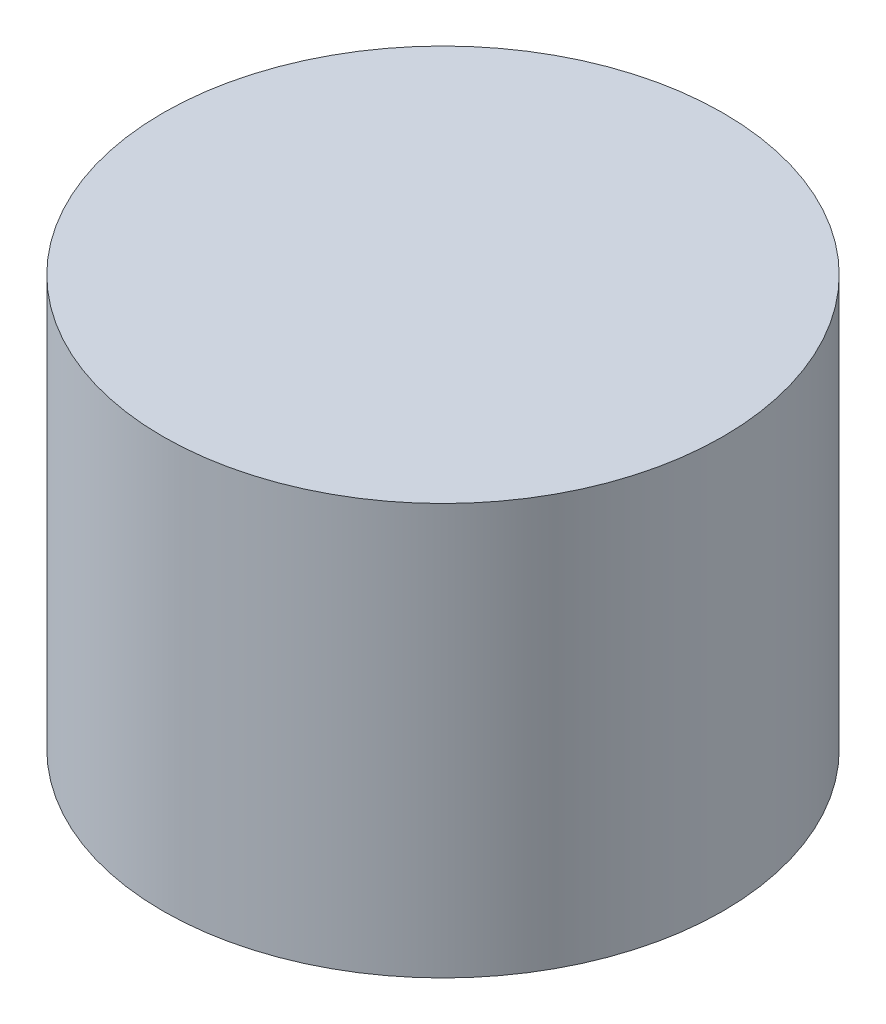
ISO-10303-21;
HEADER;
FILE_DESCRIPTION(('STEP AP214'),'2;1');
FILE_NAME('part.step','',(''),(''),'','','');
FILE_SCHEMA(('AUTOMOTIVE_DESIGN { 1 0 10303 214 1 1 1 1 }'));
ENDSEC;
DATA;
#1=APPLICATION_CONTEXT('core data for automotive mechanical design processes');
#2=APPLICATION_PROTOCOL_DEFINITION('international standard','automotive_design',2000,#1);
#3=PRODUCT_CONTEXT('',#1,'mechanical');
#4=PRODUCT('Part','Part','',(#3));
#5=PRODUCT_RELATED_PRODUCT_CATEGORY('part','',(#4));
#6=PRODUCT_DEFINITION_FORMATION('','',#4);
#7=PRODUCT_DEFINITION_CONTEXT('part definition',#1,'design');
#8=PRODUCT_DEFINITION('design','',#6,#7);
#9=PRODUCT_DEFINITION_SHAPE('','',#8);
#10=(LENGTH_UNIT() NAMED_UNIT(*) SI_UNIT(.MILLI.,.METRE.));
#11=(NAMED_UNIT(*) PLANE_ANGLE_UNIT() SI_UNIT($,.RADIAN.));
#12=(NAMED_UNIT(*) SI_UNIT($,.STERADIAN.) SOLID_ANGLE_UNIT());
#13=UNCERTAINTY_MEASURE_WITH_UNIT(LENGTH_MEASURE(1.E-05),#10,'distance_accuracy_value','');
#14=(GEOMETRIC_REPRESENTATION_CONTEXT(3) GLOBAL_UNCERTAINTY_ASSIGNED_CONTEXT((#13)) GLOBAL_UNIT_ASSIGNED_CONTEXT((#10,
#11,#12)) REPRESENTATION_CONTEXT('',''));
#15=CARTESIAN_POINT('',(0.,0.,0.));
#16=DIRECTION('',(0.,0.,1.));
#17=DIRECTION('',(1.,0.,0.));
#18=AXIS2_PLACEMENT_3D('',#15,#16,#17);
#19=CARTESIAN_POINT('',(0.,7.,0.));
#20=DIRECTION('',(0.,-1.,0.));
#21=DIRECTION('',(0.,0.,-1.));
#22=AXIS2_PLACEMENT_3D('',#19,#20,#21);
#23=CYLINDRICAL_SURFACE('',#22,6.5);
#24=CARTESIAN_POINT('',(0.,3.,0.));
#25=DIRECTION('',(0.,-1.,0.));
#26=DIRECTION('',(0.,0.,-1.));
#27=AXIS2_PLACEMENT_3D('',#24,#25,#26);
#28=CIRCLE('',#27,6.5);
#29=CARTESIAN_POINT('',(0.,3.,-6.5));
#30=VERTEX_POINT('',#29);
#31=EDGE_CURVE('E11',#30,#30,#28,.T.);
#32=ORIENTED_EDGE('',*,*,#31,.T.);
#33=EDGE_LOOP('',(#32));
#34=FACE_BOUND('',#33,.T.);
#35=CARTESIAN_POINT('',(0.,7.,0.));
#36=DIRECTION('',(0.,-1.,0.));
#37=DIRECTION('',(0.,0.,-1.));
#38=AXIS2_PLACEMENT_3D('',#35,#36,#37);
#39=CIRCLE('',#38,6.5);
#40=CARTESIAN_POINT('',(1.73205080756889,7.,-6.26498204307083));
#41=VERTEX_POINT('',#40);
#42=CARTESIAN_POINT('',(1.73205080756888,7.,6.26498204307083));
#43=VERTEX_POINT('',#42);
#44=EDGE_CURVE('E100',#41,#43,#39,.T.);
#45=ORIENTED_EDGE('',*,*,#44,.F.);
#46=CARTESIAN_POINT('',(0.,10.,-6.50000000000001));
#47=CARTESIAN_POINT('',(0.10958647155408,9.99999903907904,-6.49999929187437));
#48=CARTESIAN_POINT('',(0.219182761349475,9.99096335239673,-6.49720235792931));
#49=CARTESIAN_POINT('',(0.435175528984374,9.95515058806477,-6.48631855265072));
#50=CARTESIAN_POINT('',(0.541571186300283,9.92836900086749,-6.47823033671536));
#51=CARTESIAN_POINT('',(0.748016546984704,9.85804929310721,-6.45764858487677));
#52=CARTESIAN_POINT('',(0.848075627090346,9.81453663922322,-6.44516174661238));
#53=CARTESIAN_POINT('',(1.03947745536718,9.71209679263276,-6.4170753591794));
#54=CARTESIAN_POINT('',(1.13081890919356,9.65316731576617,-6.40147534884382));
#55=CARTESIAN_POINT('',(1.3049369924768,9.51970232456005,-6.36829752406617));
#56=CARTESIAN_POINT('',(1.38741488565838,9.44478758075688,-6.35067760587489));
#57=CARTESIAN_POINT('',(1.53885708269873,9.28228637649204,-6.31569252815343));
#58=CARTESIAN_POINT('',(1.60781896662595,9.19469765172806,-6.29832741475793));
#59=CARTESIAN_POINT('',(1.73187276184926,9.00677139557264,-6.2653687784566));
#60=CARTESIAN_POINT('',(1.78659481361997,8.90617971070223,-6.24982736044083));
#61=CARTESIAN_POINT('',(1.8782224418158,8.69666603626275,-6.22290748386974));
#62=CARTESIAN_POINT('',(1.91513254914664,8.58774617334561,-6.21152796681116));
#63=CARTESIAN_POINT('',(1.96900160513188,8.36803269394755,-6.19466009001292));
#64=CARTESIAN_POINT('',(1.98651339555991,8.25738746639271,-6.18900890037713));
#65=CARTESIAN_POINT('',(2.0028155589542,8.03459625942759,-6.1837537050085));
#66=CARTESIAN_POINT('',(2.00161073572821,7.9224506724825,-6.1841481476028));
#67=CARTESIAN_POINT('',(1.98094698228322,7.7043849294011,-6.19079569362892));
#68=CARTESIAN_POINT('',(1.96218684702854,7.59839057467777,-6.19682450731138));
#69=CARTESIAN_POINT('',(1.90807645250929,7.39113330340309,-6.2136977225505));
#70=CARTESIAN_POINT('',(1.87272447914839,7.28987087689416,-6.22454262164885));
#71=CARTESIAN_POINT('',(1.78593221700801,7.09326995215499,-6.25000070721951));
#72=CARTESIAN_POINT('',(1.73426970827152,6.99803651437155,-6.2646654217354));
#73=CARTESIAN_POINT('',(1.61647725848254,6.8173594556283,-6.29608673576222));
#74=CARTESIAN_POINT('',(1.55034365635742,6.73191832039407,-6.31284386417593));
#75=CARTESIAN_POINT('',(1.40204114131455,6.56929561166795,-6.34746551983527));
#76=CARTESIAN_POINT('',(1.31929416295853,6.49264371743337,-6.36534631113152));
#77=CARTESIAN_POINT('',(1.14189770882473,6.35417779565687,-6.39954830533242));
#78=CARTESIAN_POINT('',(1.04724740490766,6.2923648013595,-6.41586939958651));
#79=CARTESIAN_POINT('',(0.847732923697564,6.1849870228725,-6.44527556867775));
#80=CARTESIAN_POINT('',(0.742798718966915,6.13954513596117,-6.45833594999018));
#81=CARTESIAN_POINT('',(0.526280934909788,6.06711374604147,-6.47957102319473));
#82=CARTESIAN_POINT('',(0.414699321015772,6.04011881798934,-6.48774715140186));
#83=CARTESIAN_POINT('',(0.192552832432248,6.00624195342491,-6.49806290071845));
#84=CARTESIAN_POINT('',(0.0821071867281282,5.9986426474343,-6.50041772114305));
#85=CARTESIAN_POINT('',(-0.138491178007729,6.00175476648801,-6.49946000316609));
#86=CARTESIAN_POINT('',(-0.248643936188294,6.01246360693706,-6.49614826472318));
#87=CARTESIAN_POINT('',(-0.462785801451475,6.05131048211023,-6.48437074848216));
#88=CARTESIAN_POINT('',(-0.566859358780051,6.07902464716615,-6.47603039774079));
#89=CARTESIAN_POINT('',(-0.768852811369356,6.1505810764271,-6.45516726536364));
#90=CARTESIAN_POINT('',(-0.866771952253664,6.19442531327608,-6.44264397218779));
#91=CARTESIAN_POINT('',(-1.05627961444667,6.29817119480995,-6.41433382910965));
#92=CARTESIAN_POINT('',(-1.14766081519561,6.35843167676517,-6.39847611273321));
#93=CARTESIAN_POINT('',(-1.31925606832412,6.49286683008083,-6.36531333623026));
#94=CARTESIAN_POINT('',(-1.39946717074091,6.56704516497603,-6.34800789569185));
#95=CARTESIAN_POINT('',(-1.54963528009095,6.73058329944897,-6.31306645909659));
#96=CARTESIAN_POINT('',(-1.61908131008095,6.82041607594927,-6.29544322340724));
#97=CARTESIAN_POINT('',(-1.74195487773041,7.01084333460187,-6.26255963317191));
#98=CARTESIAN_POINT('',(-1.79538273895787,7.11143759931574,-6.24729923089955));
#99=CARTESIAN_POINT('',(-1.88435707765313,7.32027825692903,-6.22104126828922));
#100=CARTESIAN_POINT('',(-1.91997867102389,7.42849026977303,-6.21002584634022));
#101=CARTESIAN_POINT('',(-1.97237526121824,7.64978261572606,-6.19358575896333));
#102=CARTESIAN_POINT('',(-1.98915714872107,7.76286115316601,-6.18815904950703));
#103=CARTESIAN_POINT('',(-2.00291323790432,7.98534807210792,-6.18371932373485));
#104=CARTESIAN_POINT('',(-2.00072360720728,8.09470000455106,-6.18443554393434));
#105=CARTESIAN_POINT('',(-1.97860856561738,8.31139783884725,-6.19154584982148));
#106=CARTESIAN_POINT('',(-1.95868393542584,8.41874382879028,-6.19793968557835));
#107=CARTESIAN_POINT('',(-1.90221657867545,8.6269374285375,-6.21549850608436));
#108=CARTESIAN_POINT('',(-1.8659061649831,8.72785410568483,-6.22659666514378));
#109=CARTESIAN_POINT('',(-1.77788001247773,8.92224355662551,-6.25229841004041));
#110=CARTESIAN_POINT('',(-1.72616121006624,9.01571484538876,-6.26690269287626));
#111=CARTESIAN_POINT('',(-1.60648172875981,9.19641250748051,-6.29866516433668));
#112=CARTESIAN_POINT('',(-1.5379775201733,9.28326549413256,-6.31589943241282));
#113=CARTESIAN_POINT('',(-1.38763671757874,9.44451406697947,-6.35062263668655));
#114=CARTESIAN_POINT('',(-1.30579660000223,9.51890635028652,-6.36811163907407));
#115=CARTESIAN_POINT('',(-1.12802317077525,9.65544917959683,-6.40203042414332));
#116=CARTESIAN_POINT('',(-1.0317288656853,9.71714357533484,-6.41840990638034));
#117=CARTESIAN_POINT('',(-0.829631192009791,9.82338445665249,-6.44764383058531));
#118=CARTESIAN_POINT('',(-0.723831864032394,9.86793818662102,-6.46049976109691));
#119=CARTESIAN_POINT('',(-0.515929652571412,9.93510071206019,-6.48025348346413));
#120=CARTESIAN_POINT('',(-0.414403258515521,9.95936947108914,-6.48759534805451));
#121=CARTESIAN_POINT('',(-0.208587191828515,9.99181805932323,-6.4974684909107));
#122=CARTESIAN_POINT('',(-0.104298042658333,10.0000009145488,-6.50000067395289));
#123=CARTESIAN_POINT('',(0.,10.,-6.50000000000001));
#124=B_SPLINE_CURVE_WITH_KNOTS('',3,(#46,#47,#48,#49,#50,#51,#52,#53,#54,#55,#56,#57,#58,#59,
#60,#61,#62,#63,#64,#65,#66,#67,#68,#69,#70,#71,#72,#73,#74,#75,#76,#77,#78,#79,#80,#81,#82,#83,
#84,#85,#86,#87,#88,#89,#90,#91,#92,#93,#94,#95,#96,#97,#98,#99,#100,#101,#102,#103,#104,#105,
#106,#107,#108,#109,#110,#111,#112,#113,#114,#115,#116,#117,#118,#119,#120,#121,#122,#123),
.UNSPECIFIED.,.T.,.F.,(4,2,2,2,2,2,2,2,2,2,2,2,2,2,2,2,2,2,2,2,2,2,2,2,2,2,2,2,2,2,2,2,2,2,2,2,
2,2,4),(0.,0.328376148353205,0.656835774920465,0.984797413319646,1.31280767013795,
1.64969601962052,1.98664463123192,2.33162619975385,2.67651996741948,3.01130912746221,
3.34601236190893,3.66793485951994,3.98989062214147,4.31643724588171,4.64306657905953,
4.98408507994297,5.32512731933627,5.66867887562648,6.01212935372403,6.34267966649237,
6.67318331870837,6.99576592200042,7.31838798898983,7.64872325349811,7.97914559299322,
8.322234878021,8.66531723215741,9.00693981167225,9.34843740094787,9.67496275718919,
10.0014737403731,10.3234943027839,10.6455789342452,10.9799294848454,11.3143685200785,
11.6592775258489,12.0040405975475,12.3166287634493,12.6291581207982),.UNSPECIFIED.);
#125=CARTESIAN_POINT('',(-1.73205080756887,7.,-6.26498204307084));
#126=VERTEX_POINT('',#125);
#127=EDGE_CURVE('E149',#41,#126,#124,.T.);
#128=ORIENTED_EDGE('',*,*,#127,.T.);
#129=CARTESIAN_POINT('',(-1.73205080756888,7.,6.26498204307083));
#130=VERTEX_POINT('',#129);
#131=EDGE_CURVE('E90',#130,#126,#39,.T.);
#132=ORIENTED_EDGE('',*,*,#131,.F.);
#133=CARTESIAN_POINT('',(-2.,8.,6.18465843842648));
#134=CARTESIAN_POINT('',(-1.9999990095568,8.10944781666523,6.18465930196191));
#135=CARTESIAN_POINT('',(-1.99098535833565,8.21890548483824,6.18759551962699));
#136=CARTESIAN_POINT('',(-1.95526805100872,8.4346111816852,6.19897317486936));
#137=CARTESIAN_POINT('',(-1.92855917969018,8.54085825446286,6.2074162354361));
#138=CARTESIAN_POINT('',(-1.85845185053105,8.74698780797404,6.22876273970595));
#139=CARTESIAN_POINT('',(-1.8150822317129,8.84688094075819,6.24165847214778));
#140=CARTESIAN_POINT('',(-1.71298018316394,9.03799985089879,6.27044669026987));
#141=CARTESIAN_POINT('',(-1.65424519824939,9.12922418323406,6.28633967425532));
#142=CARTESIAN_POINT('',(-1.52098542811858,9.30345356947201,6.31992519486663));
#143=CARTESIAN_POINT('',(-1.44603755808562,9.38612742349218,6.33765756932835));
#144=CARTESIAN_POINT('',(-1.28338536224739,9.53795371808371,6.37258438430366));
#145=CARTESIAN_POINT('',(-1.19567931401686,9.607104329982,6.38977875180184));
#146=CARTESIAN_POINT('',(-1.00762969104172,9.73137363799946,6.4221466710909));
#147=CARTESIAN_POINT('',(-0.907051779246698,9.78615256785287,6.43726783390859));
#148=CARTESIAN_POINT('',(-0.697566498611637,9.87788894200935,6.46332130744831));
#149=CARTESIAN_POINT('',(-0.588661031083086,9.91485044031836,6.47425457092804));
#150=CARTESIAN_POINT('',(-0.369078789668962,9.96880071461249,6.49041842306583));
#151=CARTESIAN_POINT('',(-0.258553108996816,9.98635527672199,6.49581021502432));
#152=CARTESIAN_POINT('',(-0.0360024805210017,10.0027846064267,6.50085231846729));
#153=CARTESIAN_POINT('',(0.0760221311138315,10.0016634945557,6.50050389645218));
#154=CARTESIAN_POINT('',(0.29441356422115,9.98114844527175,6.4942177378733));
#155=CARTESIAN_POINT('',(0.400844233271026,9.96236759529849,6.48846753941673));
#156=CARTESIAN_POINT('',(0.608962506037097,9.90807040958312,6.47225351889556));
#157=CARTESIAN_POINT('',(0.71064980325399,9.8725529940272,6.46178939269854));
#158=CARTESIAN_POINT('',(0.90782598395705,9.78538875658138,6.43706860960457));
#159=CARTESIAN_POINT('',(1.00322571036048,9.73355326091787,6.42276789460409));
#160=CARTESIAN_POINT('',(1.18416561152014,9.61537480759448,6.39188462555487));
#161=CARTESIAN_POINT('',(1.26970334400256,9.54902826808111,6.37530150850161));
#162=CARTESIAN_POINT('',(1.43214818143839,9.40055088932973,6.34083036356049));
#163=CARTESIAN_POINT('',(1.50856604633594,9.31789001491942,6.32291668577951));
#164=CARTESIAN_POINT('',(1.64659789158783,9.14075606067757,6.28838540910676));
#165=CARTESIAN_POINT('',(1.70821023726841,9.04628167826866,6.27176795346722));
#166=CARTESIAN_POINT('',(1.81542815284785,8.84685693175613,6.24158384080898));
#167=CARTESIAN_POINT('',(1.86085804249382,8.74180658521936,6.22805120968131));
#168=CARTESIAN_POINT('',(1.93323233909799,8.52503128267039,6.20596978963966));
#169=CARTESIAN_POINT('',(1.96018314804153,8.41330865283467,6.19741927485068));
#170=CARTESIAN_POINT('',(1.99390183839658,8.19103547184524,6.1866516328359));
#171=CARTESIAN_POINT('',(2.00141677206859,8.0806095197673,6.18420022355391));
#172=CARTESIAN_POINT('',(1.99814331840788,7.86006861403926,6.18525890294931));
#173=CARTESIAN_POINT('',(1.98735765434067,7.74995361655912,6.18876810464339));
#174=CARTESIAN_POINT('',(1.94845591378718,7.53633739526088,6.20112183020872));
#175=CARTESIAN_POINT('',(1.92082922102701,7.43273743020314,6.20981554749739));
#176=CARTESIAN_POINT('',(1.84960144317458,7.23165311791168,6.23140033431748));
#177=CARTESIAN_POINT('',(1.80599780585853,7.13416975068448,6.24429207442193));
#178=CARTESIAN_POINT('',(1.70266083632211,6.94506908836894,6.27326823548526));
#179=CARTESIAN_POINT('',(1.642510447689,6.8536921478603,6.28943187401987));
#180=CARTESIAN_POINT('',(1.50827755720534,6.68205645444876,6.32296420859206));
#181=CARTESIAN_POINT('',(1.43419154645756,6.60180051059715,6.34033320743476));
#182=CARTESIAN_POINT('',(1.27066455897644,6.45137542136322,6.37515982745186));
#183=CARTESIAN_POINT('',(1.18072798127101,6.38173805229887,6.39259321140603));
#184=CARTESIAN_POINT('',(0.990026292988482,6.25852596385662,6.4248880498859));
#185=CARTESIAN_POINT('',(0.889261696820762,6.20495048188052,6.43974962650361));
#186=CARTESIAN_POINT('',(0.680404349890924,6.11589889700058,6.46513895511408));
#187=CARTESIAN_POINT('',(0.572372332564442,6.08028985839772,6.47569842330933));
#188=CARTESIAN_POINT('',(0.351472208803095,6.0278582342443,6.49143353701507));
#189=CARTESIAN_POINT('',(0.238605575732804,6.01102996689851,6.49661081078226));
#190=CARTESIAN_POINT('',(0.0161425784558991,5.99708774938302,6.5008937102874));
#191=CARTESIAN_POINT('',(-0.0934015930792339,5.99920450881627,6.50023627237803));
#192=CARTESIAN_POINT('',(-0.310503921550126,6.0212401975052,6.49348761016137));
#193=CARTESIAN_POINT('',(-0.418062200881387,6.04115802587313,6.48739672187997));
#194=CARTESIAN_POINT('',(-0.626896153328704,6.09774581224379,6.47053765408911));
#195=CARTESIAN_POINT('',(-0.72823100110444,6.13421524667687,6.45982553572913));
#196=CARTESIAN_POINT('',(-0.923394028801659,6.22269063398323,6.43482974334373));
#197=CARTESIAN_POINT('',(-1.01722093754076,6.27469921078922,6.4205454661916));
#198=CARTESIAN_POINT('',(-1.19809140790342,6.39477473631907,6.38931014060288));
#199=CARTESIAN_POINT('',(-1.28480651115009,6.463317333803,6.37228632231703));
#200=CARTESIAN_POINT('',(-1.44576009155786,6.61366948951744,6.33770998123227));
#201=CARTESIAN_POINT('',(-1.51999487724008,6.69548295904986,6.32015730380926));
#202=CARTESIAN_POINT('',(-1.65626040321865,6.87317697614795,6.28584951367574));
#203=CARTESIAN_POINT('',(-1.71782754366812,6.9694223551431,6.26913756348217));
#204=CARTESIAN_POINT('',(-1.82384213502379,7.17139075347286,6.23912274318891));
#205=CARTESIAN_POINT('',(-1.86829702453285,7.27710963003581,6.22581839266758));
#206=CARTESIAN_POINT('',(-1.93528263381638,7.48478819820058,6.2053035694979));
#207=CARTESIAN_POINT('',(-1.95948210366415,7.58616631120831,6.19763764909695));
#208=CARTESIAN_POINT('',(-1.99183943194677,7.79169373301637,6.18731524290854));
#209=CARTESIAN_POINT('',(-2.00000094256957,7.89584240542432,6.18465761663053));
#210=CARTESIAN_POINT('',(-2.,8.,6.18465843842648));
#211=B_SPLINE_CURVE_WITH_KNOTS('',3,(#133,#134,#135,#136,#137,#138,#139,#140,#141,#142,#143,
#144,#145,#146,#147,#148,#149,#150,#151,#152,#153,#154,#155,#156,#157,#158,#159,#160,#161,#162,
#163,#164,#165,#166,#167,#168,#169,#170,#171,#172,#173,#174,#175,#176,#177,#178,#179,#180,#181,
#182,#183,#184,#185,#186,#187,#188,#189,#190,#191,#192,#193,#194,#195,#196,#197,#198,#199,#200,
#201,#202,#203,#204,#205,#206,#207,#208,#209,#210),.UNSPECIFIED.,.T.,.F.,(4,2,2,2,2,2,2,2,2,2,2,
2,2,2,2,2,2,2,2,2,2,2,2,2,2,2,2,2,2,2,2,2,2,2,2,2,2,2,4),(0.,0.32795890482453,0.656014510157334,
0.983504805826268,1.31104959615494,1.64848092871026,1.9859578587312,2.33081172384084,
2.6755870871604,3.0100217177641,3.34438256088806,3.66754797200326,3.9907342360384,
4.31780371544651,4.64495401879589,4.98534121479608,5.32576597561374,5.66978125697087,
6.01367729564791,6.34414407424119,6.67456168122461,6.99580726669394,7.31710419166199,
7.64738828171959,7.97775564671482,8.32133560221229,8.66489924238099,9.00588210329357,
9.34676177779275,9.67386437135672,10.0009467370162,10.3241681048257,10.6474440825282,
10.9814486359996,11.3155518095369,11.6602881883484,12.0048745424384,12.3170524660658,
12.6291592918299),.UNSPECIFIED.);
#212=EDGE_CURVE('E102',#43,#130,#211,.T.);
#213=ORIENTED_EDGE('',*,*,#212,.F.);
#214=EDGE_LOOP('',(#45,#128,#132,#213));
#215=FACE_BOUND('',#214,.T.);
#216=ADVANCED_FACE('F40',(#34,#215),#23,.F.);
#217=CARTESIAN_POINT('',(0.,7.,0.));
#218=DIRECTION('',(0.,-1.,0.));
#219=DIRECTION('',(0.,0.,-1.));
#220=AXIS2_PLACEMENT_3D('',#217,#218,#219);
#221=PLANE('',#220);
#222=DIRECTION('',(0.,0.,1.));
#223=VECTOR('',#222,1.);
#224=CARTESIAN_POINT('',(1.73205080756889,7.,-7.));
#225=LINE('',#224,#223);
#226=CARTESIAN_POINT('',(1.73205080756888,7.,-4.69041575982343));
#227=VERTEX_POINT('',#226);
#228=EDGE_CURVE('E55',#41,#227,#225,.T.);
#229=ORIENTED_EDGE('',*,*,#228,.F.);
#230=ORIENTED_EDGE('',*,*,#44,.T.);
#231=DIRECTION('',(0.,0.,-1.));
#232=VECTOR('',#231,1.);
#233=CARTESIAN_POINT('',(1.73205080756888,7.,7.));
#234=LINE('',#233,#232);
#235=CARTESIAN_POINT('',(1.73205080756901,7.00000000000015,4.6904157598234));
#236=VERTEX_POINT('',#235);
#237=EDGE_CURVE('E112',#43,#236,#234,.T.);
#238=ORIENTED_EDGE('',*,*,#237,.T.);
#239=CARTESIAN_POINT('',(0.,7.,0.));
#240=DIRECTION('',(0.,-1.,0.));
#241=DIRECTION('',(0.,0.,-1.));
#242=AXIS2_PLACEMENT_3D('',#239,#240,#241);
#243=CIRCLE('',#242,5.);
#244=EDGE_CURVE('E97',#227,#236,#243,.T.);
#245=ORIENTED_EDGE('',*,*,#244,.F.);
#246=EDGE_LOOP('',(#229,#230,#238,#245));
#247=FACE_BOUND('',#246,.T.);
#248=ADVANCED_FACE('F144',(#247),#221,.T.);
#249=DIRECTION('',(0.,0.,1.));
#250=VECTOR('',#249,1.);
#251=CARTESIAN_POINT('',(-1.73205080756887,7.,-7.00000000000001));
#252=LINE('',#251,#250);
#253=CARTESIAN_POINT('',(-1.732050807569,7.00000000000014,-4.69041575982341));
#254=VERTEX_POINT('',#253);
#255=EDGE_CURVE('E82',#254,#126,#252,.F.);
#256=ORIENTED_EDGE('',*,*,#255,.F.);
#257=CARTESIAN_POINT('',(-1.73205080756888,7.,4.69041575982342));
#258=VERTEX_POINT('',#257);
#259=EDGE_CURVE('E89',#258,#254,#243,.T.);
#260=ORIENTED_EDGE('',*,*,#259,.F.);
#261=DIRECTION('',(0.,0.,-1.));
#262=VECTOR('',#261,1.);
#263=CARTESIAN_POINT('',(-1.73205080756888,7.,6.99999999999999));
#264=LINE('',#263,#262);
#265=EDGE_CURVE('E63',#258,#130,#264,.F.);
#266=ORIENTED_EDGE('',*,*,#265,.T.);
#267=ORIENTED_EDGE('',*,*,#131,.T.);
#268=EDGE_LOOP('',(#256,#260,#266,#267));
#269=FACE_BOUND('',#268,.T.);
#270=ADVANCED_FACE('F88',(#269),#221,.T.);
#271=CARTESIAN_POINT('',(0.,12.,0.));
#272=DIRECTION('',(0.,-1.,0.));
#273=DIRECTION('',(0.,0.,-1.));
#274=AXIS2_PLACEMENT_3D('',#271,#272,#273);
#275=CYLINDRICAL_SURFACE('',#274,5.);
#276=CARTESIAN_POINT('',(0.,12.,0.));
#277=DIRECTION('',(0.,-1.,0.));
#278=DIRECTION('',(0.,0.,-1.));
#279=AXIS2_PLACEMENT_3D('',#276,#277,#278);
#280=CIRCLE('',#279,5.);
#281=CARTESIAN_POINT('',(0.,12.,-5.));
#282=VERTEX_POINT('',#281);
#283=EDGE_CURVE('E96',#282,#282,#280,.T.);
#284=ORIENTED_EDGE('',*,*,#283,.F.);
#285=EDGE_LOOP('',(#284));
#286=FACE_BOUND('',#285,.T.);
#287=ORIENTED_EDGE('',*,*,#259,.T.);
#288=CARTESIAN_POINT('',(0.,10.,-5.00000000000001));
#289=CARTESIAN_POINT('',(0.107493005442892,9.99999014817627,-4.99999271227085));
#290=CARTESIAN_POINT('',(0.215172564090674,9.99128224791162,-4.99649294306933));
#291=CARTESIAN_POINT('',(0.427496480417898,9.95675229647876,-4.98283453100642));
#292=CARTESIAN_POINT('',(0.532131777561251,9.93088372091387,-4.97265778698878));
#293=CARTESIAN_POINT('',(0.734953922727406,9.86312392194117,-4.94674209213119));
#294=CARTESIAN_POINT('',(0.833160661616962,9.82128515378327,-4.93102136364072));
#295=CARTESIAN_POINT('',(1.02107197032837,9.72298082667345,-4.89556610796078));
#296=CARTESIAN_POINT('',(1.11077947675099,9.66652034508107,-4.87583297458057));
#297=CARTESIAN_POINT('',(1.2835010075704,9.53776450143906,-4.83330886170419));
#298=CARTESIAN_POINT('',(1.36606227255022,9.46489334375974,-4.8104229692919));
#299=CARTESIAN_POINT('',(1.51817500478473,9.30659999652322,-4.76460576906194));
#300=CARTESIAN_POINT('',(1.58772010713354,9.22117170278826,-4.74167444453792));
#301=CARTESIAN_POINT('',(1.71487456729288,9.03557192975773,-4.69722791797136));
#302=CARTESIAN_POINT('',(1.77181498119548,8.9349135139768,-4.67582115964951));
#303=CARTESIAN_POINT('',(1.86775471903715,8.72446360157996,-4.63833647186792));
#304=CARTESIAN_POINT('',(1.90676256428584,8.61467647215164,-4.62225601244176));
#305=CARTESIAN_POINT('',(1.96389882339587,8.3942876664079,-4.59826357660819));
#306=CARTESIAN_POINT('',(1.98289396580565,8.28394876442379,-4.59001420355605));
#307=CARTESIAN_POINT('',(2.00217296164003,8.06136500169273,-4.58164004049144));
#308=CARTESIAN_POINT('',(2.00246601631322,7.94912110537499,-4.58151125522769));
#309=CARTESIAN_POINT('',(1.98498936750455,7.73424332854196,-4.58910500279995));
#310=CARTESIAN_POINT('',(1.96847531430514,7.63148428559097,-4.5962817503845));
#311=CARTESIAN_POINT('',(1.91994688029783,7.43034044399328,-4.61676187607836));
#312=CARTESIAN_POINT('',(1.88792979480463,7.33195641188969,-4.63006632321673));
#313=CARTESIAN_POINT('',(1.80869473255107,7.13998216380396,-4.6615948508853));
#314=CARTESIAN_POINT('',(1.76117986231532,7.04653076094531,-4.67991379280788));
#315=CARTESIAN_POINT('',(1.65250646073222,6.86858418363843,-4.7193811638989));
#316=CARTESIAN_POINT('',(1.59134280510085,6.78409239059719,-4.74053065456848));
#317=CARTESIAN_POINT('',(1.45155059945444,6.619590271198,-4.78526736742271));
#318=CARTESIAN_POINT('',(1.37193746297064,6.54043127055398,-4.80891664976151));
#319=CARTESIAN_POINT('',(1.2003144274302,6.39631552199796,-4.85459824958282));
#320=CARTESIAN_POINT('',(1.10830206533444,6.33136160258971,-4.87663024445325));
#321=CARTESIAN_POINT('',(0.912077652605845,6.21638255258417,-4.91714681264549));
#322=CARTESIAN_POINT('',(0.80766049134648,6.16667771880294,-4.93555270095415));
#323=CARTESIAN_POINT('',(0.591023765482885,6.08583213892194,-4.96614828328759));
#324=CARTESIAN_POINT('',(0.478808196849678,6.05468196244259,-4.97834113462383));
#325=CARTESIAN_POINT('',(0.256895887607825,6.0135517045803,-4.99456139506911));
#326=CARTESIAN_POINT('',(0.14744329398554,6.00242754574644,-4.99902945833514));
#327=CARTESIAN_POINT('',(-0.0718453098078114,5.99828689947138,-5.00068478510631));
#328=CARTESIAN_POINT('',(-0.181681213223918,6.00526571845249,-4.99787393582292));
#329=CARTESIAN_POINT('',(-0.393432739121981,6.03629175255199,-4.98557567063754));
#330=CARTESIAN_POINT('',(-0.495482491775468,6.05955798035098,-4.97639391345524));
#331=CARTESIAN_POINT('',(-0.694135428060775,6.12143570830981,-4.952594414055));
#332=CARTESIAN_POINT('',(-0.790737910224841,6.16004917966868,-4.9379759735653));
#333=CARTESIAN_POINT('',(-0.979078785816698,6.25278493967995,-4.90416594770812));
#334=CARTESIAN_POINT('',(-1.0705780227554,6.30734547204315,-4.88484815979804));
#335=CARTESIAN_POINT('',(-1.24344359124655,6.42994032390564,-4.84373364745525));
#336=CARTESIAN_POINT('',(-1.32480584076112,6.49798004292261,-4.82193593110271));
#337=CARTESIAN_POINT('',(-1.48072304302882,6.65087001294962,-4.77645117638113));
#338=CARTESIAN_POINT('',(-1.55447393380606,6.73653354150621,-4.75273441425052));
#339=CARTESIAN_POINT('',(-1.68675119741371,6.91944008300937,-4.70741672917132));
#340=CARTESIAN_POINT('',(-1.74527506133751,7.01668500033995,-4.68581615526512));
#341=CARTESIAN_POINT('',(-1.84580750193163,7.2214616945941,-4.64714299907709));
#342=CARTESIAN_POINT('',(-1.88765059453445,7.32908399921231,-4.63011630884788));
#343=CARTESIAN_POINT('',(-1.9522962197053,7.55073365171515,-4.60323673477932));
#344=CARTESIAN_POINT('',(-1.97511280526931,7.66475620581242,-4.59337855695999));
#345=CARTESIAN_POINT('',(-1.9997156172784,7.88712790177454,-4.58271759299927));
#346=CARTESIAN_POINT('',(-2.00289708230286,7.99529483959335,-4.58131421008172));
#347=CARTESIAN_POINT('',(-1.99180315927752,8.21054485771329,-4.58614836033098));
#348=CARTESIAN_POINT('',(-1.97752998791378,8.31762807390258,-4.59238492324794));
#349=CARTESIAN_POINT('',(-1.93307136615365,8.52333218985504,-4.61126649079021));
#350=CARTESIAN_POINT('',(-1.90353749357097,8.622120274433,-4.6236483182745));
#351=CARTESIAN_POINT('',(-1.83000544849101,8.81337862961348,-4.65324001232697));
#352=CARTESIAN_POINT('',(-1.78600328139381,8.90584714689982,-4.67045121206008));
#353=CARTESIAN_POINT('',(-1.68187276275973,9.08760961927078,-4.70898609604492));
#354=CARTESIAN_POINT('',(-1.62096533515948,9.17641867013048,-4.73048882313242));
#355=CARTESIAN_POINT('',(-1.48589211927149,9.34299331720375,-4.77463804372237));
#356=CARTESIAN_POINT('',(-1.41172233481812,9.42075557212831,-4.79728488048407));
#357=CARTESIAN_POINT('',(-1.24650550627246,9.56820285326361,-4.84293567087395));
#358=CARTESIAN_POINT('',(-1.15467600114614,9.63703730689806,-4.86586757962186));
#359=CARTESIAN_POINT('',(-0.959900320285775,9.75833704262163,-4.90800406713717));
#360=CARTESIAN_POINT('',(-0.856949004547234,9.81079471215252,-4.92720691092906));
#361=CARTESIAN_POINT('',(-0.6447380624952,9.89662221519029,-4.95939714815861));
#362=CARTESIAN_POINT('',(-0.535631618219692,9.93032932356034,-4.97249363055028));
#363=CARTESIAN_POINT('',(-0.312876546281215,9.97863912095426,-4.99144306209366));
#364=CARTESIAN_POINT('',(-0.199243525858908,9.9933024367439,-4.99731899495638));
#365=CARTESIAN_POINT('',(-0.0569122978909262,9.99939538097827,-4.99975899504137));
#366=CARTESIAN_POINT('',(-0.0284626887407567,10.0000026086292,-5.00000192969176));
#367=CARTESIAN_POINT('',(0.,10.,-5.00000000000001));
#368=B_SPLINE_CURVE_WITH_KNOTS('',3,(#288,#289,#290,#291,#292,#293,#294,#295,#296,#297,#298,
#299,#300,#301,#302,#303,#304,#305,#306,#307,#308,#309,#310,#311,#312,#313,#314,#315,#316,#317,
#318,#319,#320,#321,#322,#323,#324,#325,#326,#327,#328,#329,#330,#331,#332,#333,#334,#335,#336,
#337,#338,#339,#340,#341,#342,#343,#344,#345,#346,#347,#348,#349,#350,#351,#352,#353,#354,#355,
#356,#357,#358,#359,#360,#361,#362,#363,#364,#365,#366,#367),.UNSPECIFIED.,.T.,.F.,(4,2,2,2,2,2,
2,2,2,2,2,2,2,2,2,2,2,2,2,2,2,2,2,2,2,2,2,2,2,2,2,2,2,2,2,2,2,2,2,4),(0.,0.322402987893073,
0.645683636007937,0.967911457471584,1.29002753567985,1.62597381700398,1.96208394934412,
2.31315258819217,2.66405423118268,2.99904105308829,3.33386306340488,3.64538328401373,
3.95695787256048,4.27489126298816,4.59294421938184,4.93558349186557,5.27829092839733,
5.62776913162807,5.97706956113791,6.30569184528008,6.63422893570082,6.94800455564366,
7.26182048993797,7.58523513398263,7.90877959498969,8.25368474624414,8.59864669043748,
8.94695045140828,9.29499672645934,9.61799673392748,9.94095572563046,10.2511431854877,
10.5614163580516,10.8894546805669,11.2175920134839,11.5670042353384,11.9165786364053,
12.2596430101332,12.6016125240434,12.686980458968),.UNSPECIFIED.);
#369=EDGE_CURVE('E48',#254,#227,#368,.T.);
#370=ORIENTED_EDGE('',*,*,#369,.T.);
#371=ORIENTED_EDGE('',*,*,#244,.T.);
#372=CARTESIAN_POINT('',(-2.,8.,4.58257569495583));
#373=CARTESIAN_POINT('',(-1.99999540068023,8.10712368971296,4.58258022779734));
#374=CARTESIAN_POINT('',(-1.99134173553407,8.21442629433184,4.58638433797122));
#375=CARTESIAN_POINT('',(-1.95706710874823,8.42593908409957,4.601110833066));
#376=CARTESIAN_POINT('',(-1.93140279032341,8.53014065433852,4.61205140628346));
#377=CARTESIAN_POINT('',(-1.86423554476216,8.73205180897082,4.63960410719221));
#378=CARTESIAN_POINT('',(-1.82279228998551,8.82978424329122,4.65619484260882));
#379=CARTESIAN_POINT('',(-1.72542013194152,9.0168853548623,4.69314677188873));
#380=CARTESIAN_POINT('',(-1.66949439157707,9.1062558525241,4.71350714220611));
#381=CARTESIAN_POINT('',(-1.54132201423254,9.27926031454433,4.75700861562335));
#382=CARTESIAN_POINT('',(-1.46837936836551,9.36235639939724,4.78023917022606));
#383=CARTESIAN_POINT('',(-1.30970909513216,9.5155290208558,4.82612457915278));
#384=CARTESIAN_POINT('',(-1.22397701877347,9.5856010077097,4.84877922991761));
#385=CARTESIAN_POINT('',(-1.03800631337303,9.71340639030971,4.89203407641395));
#386=CARTESIAN_POINT('',(-0.937328966419095,9.77054429968594,4.9125180361257));
#387=CARTESIAN_POINT('',(-0.726825322068637,9.86684357017379,4.94803927702516));
#388=CARTESIAN_POINT('',(-0.617002769076881,9.90601224624887,4.96307877403249));
#389=CARTESIAN_POINT('',(-0.396966427039752,9.96334148599309,4.98538324990609));
#390=CARTESIAN_POINT('',(-0.287028984858316,9.98242731397022,4.99298936770628));
#391=CARTESIAN_POINT('',(-0.0652663285839641,10.0020284857814,5.0008031068743));
#392=CARTESIAN_POINT('',(0.0465581658394078,10.0025507559658,5.00101348770555));
#393=CARTESIAN_POINT('',(0.262232494702086,9.9855172301958,4.99421962820612));
#394=CARTESIAN_POINT('',(0.366177452870455,9.96897522724528,4.98761996771485));
#395=CARTESIAN_POINT('',(0.569673109221913,9.92000712369703,4.96849291469141));
#396=CARTESIAN_POINT('',(0.669223484391238,9.88757985760154,4.95596508721341));
#397=CARTESIAN_POINT('',(0.862897938510558,9.80736351712174,4.92596824457466));
#398=CARTESIAN_POINT('',(0.956917623378896,9.75935028518462,4.90842760466223));
#399=CARTESIAN_POINT('',(1.13580815074131,9.64953499308084,4.87014585180275));
#400=CARTESIAN_POINT('',(1.22067584271796,9.58772820689983,4.84940364267149));
#401=CARTESIAN_POINT('',(1.38476882799017,9.44735086405612,4.80521637176122));
#402=CARTESIAN_POINT('',(1.46325784526632,9.3679461074272,4.78168326511759));
#403=CARTESIAN_POINT('',(1.60610741539265,9.197009428168,4.73561660973263));
#404=CARTESIAN_POINT('',(1.67046334378698,9.10547355180439,4.71308339008076));
#405=CARTESIAN_POINT('',(1.78490418871927,8.90958097762606,4.67096897409023));
#406=CARTESIAN_POINT('',(1.83453465163626,8.80493516966135,4.65148914057708));
#407=CARTESIAN_POINT('',(1.91517625986646,8.58778450968778,4.61887590344084));
#408=CARTESIAN_POINT('',(1.94619949837798,8.47528481527341,4.6057383789131));
#409=CARTESIAN_POINT('',(1.98695494885489,8.25296422253256,4.58829759702715));
#410=CARTESIAN_POINT('',(1.99787209681454,8.14339955287144,4.58350366456138));
#411=CARTESIAN_POINT('',(2.00156132644289,7.92392279224044,4.58189497869038));
#412=CARTESIAN_POINT('',(1.99433891059128,7.81401081672434,4.58507780560361));
#413=CARTESIAN_POINT('',(1.96303289479003,7.60354106504306,4.59856044359113));
#414=CARTESIAN_POINT('',(1.93993306202386,7.50280706259994,4.60844457798301));
#415=CARTESIAN_POINT('',(1.87880418691087,7.30671159521455,4.6337005102734));
#416=CARTESIAN_POINT('',(1.84077183430228,7.21135132689285,4.64907352488598));
#417=CARTESIAN_POINT('',(1.74913563948157,7.02439764220434,4.68433781860101));
#418=CARTESIAN_POINT('',(1.69496286826465,6.93311381130546,4.70438704639177));
#419=CARTESIAN_POINT('',(1.57316522444182,6.76051701255841,4.74650385157795));
#420=CARTESIAN_POINT('',(1.50553487348189,6.67920812720455,4.76857224896045));
#421=CARTESIAN_POINT('',(1.35284421168058,6.52262659140063,4.81420915971417));
#422=CARTESIAN_POINT('',(1.26686542944543,6.4482434347084,4.83776807285233));
#423=CARTESIAN_POINT('',(1.0830836333685,6.31482292339023,4.88219794567532));
#424=CARTESIAN_POINT('',(0.985280138466605,6.25578619340488,4.90306879593135));
#425=CARTESIAN_POINT('',(0.780279934003012,6.15495237353666,4.93983715900389));
#426=CARTESIAN_POINT('',(0.673085480998743,6.11315115582633,4.9557358624066));
#427=CARTESIAN_POINT('',(0.452393590914546,6.04845114760024,4.98072713468904));
#428=CARTESIAN_POINT('',(0.338899610276817,6.02554209858931,4.98982339706103));
#429=CARTESIAN_POINT('',(0.116816510362613,6.00049529834715,4.99979008211858));
#430=CARTESIAN_POINT('',(0.00839049265208421,5.99709987143797,5.00115846749745));
#431=CARTESIAN_POINT('',(-0.207433835792269,6.00785547938346,4.99686042373721));
#432=CARTESIAN_POINT('',(-0.31483229961439,6.02200385815558,4.99119505948774));
#433=CARTESIAN_POINT('',(-0.5221709017334,6.06654678799988,4.97371513381836));
#434=CARTESIAN_POINT('',(-0.622238803864871,6.09642894475655,4.96209480698998));
#435=CARTESIAN_POINT('',(-0.815922355542606,6.17105280588107,4.93394947767358));
#436=CARTESIAN_POINT('',(-0.909536811189125,6.21579725093909,4.91742357062859));
#437=CARTESIAN_POINT('',(-1.09220303880516,6.32110319335323,4.88018094611867));
#438=CARTESIAN_POINT('',(-1.18087037518738,6.38227627532513,4.859311306872));
#439=CARTESIAN_POINT('',(-1.34705404014793,6.51778853874699,4.8158940222708));
#440=CARTESIAN_POINT('',(-1.42456572919735,6.59213316960821,4.79334568464252));
#441=CARTESIAN_POINT('',(-1.57120121894449,6.75731514684866,4.74737767367679));
#442=CARTESIAN_POINT('',(-1.63950871002775,6.8488885751441,4.72399047228096));
#443=CARTESIAN_POINT('',(-1.7598476276315,7.04294243572083,4.68049656850749));
#444=CARTESIAN_POINT('',(-1.81187714055768,7.14542414845354,4.66039025195447));
#445=CARTESIAN_POINT('',(-1.89399048451634,7.3490361864702,4.62758914239063));
#446=CARTESIAN_POINT('',(-1.92562535665267,7.44946160271244,4.61439096680415));
#447=CARTESIAN_POINT('',(-1.97271990928489,7.65448904149264,4.59445826034119));
#448=CARTESIAN_POINT('',(-1.98822466191609,7.75907857342435,4.58770572290433));
#449=CARTESIAN_POINT('',(-1.99692202185513,7.88677823911152,4.5839176394209));
#450=CARTESIAN_POINT('',(-1.99807530751895,7.90940148035643,4.58341531117284));
#451=CARTESIAN_POINT('',(-1.9996148112425,7.95468047679722,4.58274384722723));
#452=CARTESIAN_POINT('',(-2.0000009730612,7.97733623425516,4.5825747359592));
#453=CARTESIAN_POINT('',(-2.,8.,4.58257569495583));
#454=B_SPLINE_CURVE_WITH_KNOTS('',3,(#372,#373,#374,#375,#376,#377,#378,#379,#380,#381,#382,
#383,#384,#385,#386,#387,#388,#389,#390,#391,#392,#393,#394,#395,#396,#397,#398,#399,#400,#401,
#402,#403,#404,#405,#406,#407,#408,#409,#410,#411,#412,#413,#414,#415,#416,#417,#418,#419,#420,
#421,#422,#423,#424,#425,#426,#427,#428,#429,#430,#431,#432,#433,#434,#435,#436,#437,#438,#439,
#440,#441,#442,#443,#444,#445,#446,#447,#448,#449,#450,#451,#452,#453),.UNSPECIFIED.,.T.,.F.,(4,
2,2,2,2,2,2,2,2,2,2,2,2,2,2,2,2,2,2,2,2,2,2,2,2,2,2,2,2,2,2,2,2,2,2,2,2,2,2,2,4),(0.,
0.321277648767655,0.643377335822244,0.964270823293389,1.28509428823861,1.62255618284425,
1.96013574348342,2.31102669091428,2.66177466969481,2.99554182887184,3.32918445305672,
3.64408644830302,3.9590115512906,4.27868300234898,4.59846414940031,4.93924044081356,
5.28012807127127,5.63064458717257,5.98093304800101,6.30982147524421,6.63861014907939,
6.94867248085145,7.25880358651638,7.58151154652701,7.9043511452585,8.2510373424698,
8.59773764852748,8.94435487312813,9.29078375954136,9.61461039755953,9.93838801512602,
10.2522199444335,10.5661097782859,10.8938705113993,11.2217671656421,11.5699625328561,
11.9181988175919,12.2351666081908,12.5512463021924,12.619212852096,12.6871843847256),.UNSPECIFIED.);
#455=EDGE_CURVE('E95',#258,#236,#454,.T.);
#456=ORIENTED_EDGE('',*,*,#455,.F.);
#457=EDGE_LOOP('',(#287,#370,#371,#456));
#458=FACE_BOUND('',#457,.T.);
#459=ADVANCED_FACE('F93',(#286,#458),#275,.F.);
#460=CARTESIAN_POINT('',(0.,8.,-7.00000000000001));
#461=DIRECTION('',(0.,0.,1.));
#462=DIRECTION('',(1.,0.,0.));
#463=AXIS2_PLACEMENT_3D('',#460,#461,#462);
#464=CYLINDRICAL_SURFACE('',#463,0.9);
#465=CARTESIAN_POINT('',(0.,8.,-2.));
#466=DIRECTION('',(0.,0.,1.));
#467=DIRECTION('',(1.,0.,0.));
#468=AXIS2_PLACEMENT_3D('',#465,#466,#467);
#469=CIRCLE('',#468,0.9);
#470=CARTESIAN_POINT('',(0.9,8.,-2.));
#471=VERTEX_POINT('',#470);
#472=EDGE_CURVE('E87',#471,#471,#469,.F.);
#473=ORIENTED_EDGE('',*,*,#472,.F.);
#474=EDGE_LOOP('',(#473));
#475=FACE_BOUND('',#474,.T.);
#476=CARTESIAN_POINT('',(0.,8.,2.));
#477=DIRECTION('',(0.,0.,1.));
#478=DIRECTION('',(1.,0.,0.));
#479=AXIS2_PLACEMENT_3D('',#476,#477,#478);
#480=CIRCLE('',#479,0.9);
#481=CARTESIAN_POINT('',(0.9,8.,2.));
#482=VERTEX_POINT('',#481);
#483=EDGE_CURVE('E109',#482,#482,#480,.F.);
#484=ORIENTED_EDGE('',*,*,#483,.T.);
#485=EDGE_LOOP('',(#484));
#486=FACE_BOUND('',#485,.T.);
#487=ADVANCED_FACE('F131',(#475,#486),#464,.T.);
#488=CARTESIAN_POINT('',(0.,12.,0.));
#489=DIRECTION('',(0.,-1.,0.));
#490=DIRECTION('',(0.,0.,-1.));
#491=AXIS2_PLACEMENT_3D('',#488,#489,#490);
#492=PLANE('',#491);
#493=ORIENTED_EDGE('',*,*,#283,.T.);
#494=EDGE_LOOP('',(#493));
#495=FACE_BOUND('',#494,.T.);
#496=ADVANCED_FACE('F128',(#495),#492,.T.);
#497=CARTESIAN_POINT('',(0.,8.,6.99999999999999));
#498=DIRECTION('',(0.,0.,-1.));
#499=DIRECTION('',(-1.,0.,0.));
#500=AXIS2_PLACEMENT_3D('',#497,#498,#499);
#501=CYLINDRICAL_SURFACE('',#500,2.);
#502=CARTESIAN_POINT('',(0.,8.,2.));
#503=DIRECTION('',(0.,0.,1.));
#504=DIRECTION('',(1.,0.,0.));
#505=AXIS2_PLACEMENT_3D('',#502,#503,#504);
#506=CIRCLE('',#505,2.);
#507=CARTESIAN_POINT('',(2.,8.,2.));
#508=VERTEX_POINT('',#507);
#509=EDGE_CURVE('E113',#508,#508,#506,.T.);
#510=ORIENTED_EDGE('',*,*,#509,.T.);
#511=EDGE_LOOP('',(#510));
#512=FACE_BOUND('',#511,.T.);
#513=ORIENTED_EDGE('',*,*,#237,.F.);
#514=ORIENTED_EDGE('',*,*,#212,.T.);
#515=ORIENTED_EDGE('',*,*,#265,.F.);
#516=ORIENTED_EDGE('',*,*,#455,.T.);
#517=EDGE_LOOP('',(#513,#514,#515,#516));
#518=FACE_BOUND('',#517,.T.);
#519=ADVANCED_FACE('F123',(#512,#518),#501,.T.);
#520=CARTESIAN_POINT('',(0.,8.,2.));
#521=DIRECTION('',(0.,0.,1.));
#522=DIRECTION('',(1.,0.,0.));
#523=AXIS2_PLACEMENT_3D('',#520,#521,#522);
#524=PLANE('',#523);
#525=ORIENTED_EDGE('',*,*,#483,.F.);
#526=EDGE_LOOP('',(#525));
#527=FACE_BOUND('',#526,.T.);
#528=ORIENTED_EDGE('',*,*,#509,.F.);
#529=EDGE_LOOP('',(#528));
#530=FACE_BOUND('',#529,.T.);
#531=ADVANCED_FACE('F127',(#527,#530),#524,.F.);
#532=CARTESIAN_POINT('',(0.,8.,-7.00000000000001));
#533=DIRECTION('',(0.,0.,1.));
#534=DIRECTION('',(1.,0.,0.));
#535=AXIS2_PLACEMENT_3D('',#532,#533,#534);
#536=CYLINDRICAL_SURFACE('',#535,2.);
#537=CARTESIAN_POINT('',(0.,8.,-2.));
#538=DIRECTION('',(0.,0.,1.));
#539=DIRECTION('',(1.,0.,0.));
#540=AXIS2_PLACEMENT_3D('',#537,#538,#539);
#541=CIRCLE('',#540,2.);
#542=CARTESIAN_POINT('',(2.,8.,-2.));
#543=VERTEX_POINT('',#542);
#544=EDGE_CURVE('E91',#543,#543,#541,.T.);
#545=ORIENTED_EDGE('',*,*,#544,.F.);
#546=EDGE_LOOP('',(#545));
#547=FACE_BOUND('',#546,.T.);
#548=ORIENTED_EDGE('',*,*,#127,.F.);
#549=ORIENTED_EDGE('',*,*,#228,.T.);
#550=ORIENTED_EDGE('',*,*,#369,.F.);
#551=ORIENTED_EDGE('',*,*,#255,.T.);
#552=EDGE_LOOP('',(#548,#549,#550,#551));
#553=FACE_BOUND('',#552,.T.);
#554=ADVANCED_FACE('F81',(#547,#553),#536,.T.);
#555=CARTESIAN_POINT('',(0.,8.,-2.));
#556=DIRECTION('',(0.,0.,1.));
#557=DIRECTION('',(1.,0.,0.));
#558=AXIS2_PLACEMENT_3D('',#555,#556,#557);
#559=PLANE('',#558);
#560=ORIENTED_EDGE('',*,*,#472,.T.);
#561=EDGE_LOOP('',(#560));
#562=FACE_BOUND('',#561,.T.);
#563=ORIENTED_EDGE('',*,*,#544,.T.);
#564=EDGE_LOOP('',(#563));
#565=FACE_BOUND('',#564,.T.);
#566=ADVANCED_FACE('F158',(#562,#565),#559,.T.);
#567=CARTESIAN_POINT('',(0.,13.,0.));
#568=DIRECTION('',(0.,1.,0.));
#569=DIRECTION('',(0.,0.,1.));
#570=AXIS2_PLACEMENT_3D('',#567,#568,#569);
#571=PLANE('',#570);
#572=CARTESIAN_POINT('',(0.,13.,0.));
#573=DIRECTION('',(0.,1.,0.));
#574=DIRECTION('',(0.,0.,1.));
#575=AXIS2_PLACEMENT_3D('',#572,#573,#574);
#576=CIRCLE('',#575,7.5);
#577=CARTESIAN_POINT('',(0.,13.,-7.5));
#578=VERTEX_POINT('',#577);
#579=EDGE_CURVE('E106',#578,#578,#576,.T.);
#580=ORIENTED_EDGE('',*,*,#579,.T.);
#581=EDGE_LOOP('',(#580));
#582=FACE_BOUND('',#581,.T.);
#583=ADVANCED_FACE('F146',(#582),#571,.T.);
#584=CARTESIAN_POINT('',(0.,13.,0.));
#585=DIRECTION('',(0.,-1.,0.));
#586=DIRECTION('',(0.,0.,-1.));
#587=AXIS2_PLACEMENT_3D('',#584,#585,#586);
#588=CYLINDRICAL_SURFACE('',#587,7.5);
#589=CARTESIAN_POINT('',(0.,2.,0.));
#590=DIRECTION('',(0.,-1.,0.));
#591=DIRECTION('',(0.,0.,-1.));
#592=AXIS2_PLACEMENT_3D('',#589,#590,#591);
#593=CIRCLE('',#592,7.5);
#594=CARTESIAN_POINT('',(0.,2.,-7.5));
#595=VERTEX_POINT('',#594);
#596=EDGE_CURVE('E176',#595,#595,#593,.T.);
#597=CARTESIAN_POINT('',(0.,13.,-7.5));
#598=CARTESIAN_POINT('',(0.,12.8854166666667,-7.5));
#599=CARTESIAN_POINT('',(0.,12.7708333333333,-7.5));
#600=CARTESIAN_POINT('',(0.,12.5416666666667,-7.5));
#601=CARTESIAN_POINT('',(0.,12.4270833333333,-7.5));
#602=CARTESIAN_POINT('',(0.,12.1979166666667,-7.5));
#603=CARTESIAN_POINT('',(0.,12.0833333333333,-7.5));
#604=CARTESIAN_POINT('',(0.,11.8541666666667,-7.5));
#605=CARTESIAN_POINT('',(0.,11.7395833333333,-7.5));
#606=CARTESIAN_POINT('',(0.,11.5104166666667,-7.5));
#607=CARTESIAN_POINT('',(0.,11.3958333333333,-7.5));
#608=CARTESIAN_POINT('',(0.,11.1666666666667,-7.5));
#609=CARTESIAN_POINT('',(0.,11.0520833333333,-7.5));
#610=CARTESIAN_POINT('',(0.,10.8229166666667,-7.5));
#611=CARTESIAN_POINT('',(0.,10.7083333333333,-7.5));
#612=CARTESIAN_POINT('',(0.,10.4791666666667,-7.5));
#613=CARTESIAN_POINT('',(0.,10.3645833333333,-7.5));
#614=CARTESIAN_POINT('',(0.,10.1354166666667,-7.5));
#615=CARTESIAN_POINT('',(0.,10.0208333333333,-7.5));
#616=CARTESIAN_POINT('',(0.,9.79166666666667,-7.5));
#617=CARTESIAN_POINT('',(0.,9.67708333333333,-7.5));
#618=CARTESIAN_POINT('',(0.,9.44791666666667,-7.5));
#619=CARTESIAN_POINT('',(0.,9.33333333333333,-7.5));
#620=CARTESIAN_POINT('',(0.,9.10416666666667,-7.5));
#621=CARTESIAN_POINT('',(0.,8.98958333333333,-7.5));
#622=CARTESIAN_POINT('',(0.,8.76041666666667,-7.5));
#623=CARTESIAN_POINT('',(0.,8.64583333333333,-7.5));
#624=CARTESIAN_POINT('',(0.,8.41666666666667,-7.5));
#625=CARTESIAN_POINT('',(0.,8.30208333333333,-7.5));
#626=CARTESIAN_POINT('',(0.,8.07291666666667,-7.5));
#627=CARTESIAN_POINT('',(0.,7.95833333333333,-7.5));
#628=CARTESIAN_POINT('',(0.,7.72916666666667,-7.5));
#629=CARTESIAN_POINT('',(0.,7.61458333333333,-7.5));
#630=CARTESIAN_POINT('',(0.,7.38541666666667,-7.5));
#631=CARTESIAN_POINT('',(0.,7.27083333333333,-7.5));
#632=CARTESIAN_POINT('',(0.,7.04166666666667,-7.5));
#633=CARTESIAN_POINT('',(0.,6.92708333333333,-7.5));
#634=CARTESIAN_POINT('',(0.,6.69791666666667,-7.5));
#635=CARTESIAN_POINT('',(0.,6.58333333333333,-7.5));
#636=CARTESIAN_POINT('',(0.,6.35416666666667,-7.5));
#637=CARTESIAN_POINT('',(0.,6.23958333333333,-7.5));
#638=CARTESIAN_POINT('',(0.,6.01041666666667,-7.5));
#639=CARTESIAN_POINT('',(0.,5.89583333333334,-7.5));
#640=CARTESIAN_POINT('',(0.,5.66666666666667,-7.5));
#641=CARTESIAN_POINT('',(0.,5.55208333333333,-7.5));
#642=CARTESIAN_POINT('',(0.,5.32291666666667,-7.5));
#643=CARTESIAN_POINT('',(0.,5.20833333333333,-7.5));
#644=CARTESIAN_POINT('',(0.,4.97916666666667,-7.5));
#645=CARTESIAN_POINT('',(0.,4.86458333333333,-7.5));
#646=CARTESIAN_POINT('',(0.,4.63541666666667,-7.5));
#647=CARTESIAN_POINT('',(0.,4.52083333333333,-7.5));
#648=CARTESIAN_POINT('',(0.,4.29166666666667,-7.5));
#649=CARTESIAN_POINT('',(0.,4.17708333333334,-7.5));
#650=CARTESIAN_POINT('',(0.,3.94791666666667,-7.5));
#651=CARTESIAN_POINT('',(0.,3.83333333333333,-7.5));
#652=CARTESIAN_POINT('',(0.,3.60416666666667,-7.5));
#653=CARTESIAN_POINT('',(0.,3.48958333333333,-7.5));
#654=CARTESIAN_POINT('',(0.,3.26041666666667,-7.5));
#655=CARTESIAN_POINT('',(0.,3.14583333333333,-7.5));
#656=CARTESIAN_POINT('',(0.,2.91666666666667,-7.5));
#657=CARTESIAN_POINT('',(0.,2.80208333333334,-7.5));
#658=CARTESIAN_POINT('',(0.,2.57291666666667,-7.5));
#659=CARTESIAN_POINT('',(0.,2.45833333333334,-7.5));
#660=CARTESIAN_POINT('',(0.,2.22916666666667,-7.5));
#661=CARTESIAN_POINT('',(0.,2.11458333333334,-7.5));
#662=CARTESIAN_POINT('',(0.,2.,-7.5));
#663=B_SPLINE_CURVE_WITH_KNOTS('',3,(#597,#598,#599,#600,#601,#602,#603,#604,#605,#606,#607,
#608,#609,#610,#611,#612,#613,#614,#615,#616,#617,#618,#619,#620,#621,#622,#623,#624,#625,#626,
#627,#628,#629,#630,#631,#632,#633,#634,#635,#636,#637,#638,#639,#640,#641,#642,#643,#644,#645,
#646,#647,#648,#649,#650,#651,#652,#653,#654,#655,#656,#657,#658,#659,#660,#661,#662),
.UNSPECIFIED.,.F.,.F.,(4,2,2,2,2,2,2,2,2,2,2,2,2,2,2,2,2,2,2,2,2,2,2,2,2,2,2,2,2,2,2,2,4),(0.,
0.343749999999999,0.687499999999999,1.03125,1.375,1.71875,2.0625,2.40625,2.75,3.09375,3.4375,
3.78125,4.125,4.46875,4.8125,5.15625,5.5,5.84375,6.1875,6.53125,6.875,7.21875,7.5625,7.90625,
8.25,8.59375,8.9375,9.28125,9.625,9.96875,10.3125,10.65625,11.),.UNSPECIFIED.);
#664=EDGE_CURVE('BSEAM169',#578,#595,#663,.T.);
#665=ORIENTED_EDGE('',*,*,#579,.F.);
#666=ORIENTED_EDGE('',*,*,#596,.F.);
#667=ORIENTED_EDGE('',*,*,#664,.T.);
#668=ORIENTED_EDGE('',*,*,#664,.F.);
#669=EDGE_LOOP('',(#665,#667,#666,#668));
#670=FACE_BOUND('',#669,.T.);
#671=ADVANCED_FACE('F169',(#670),#588,.T.);
#672=CARTESIAN_POINT('',(0.,2.,0.));
#673=DIRECTION('',(0.,-1.,0.));
#674=DIRECTION('',(0.,0.,-1.));
#675=AXIS2_PLACEMENT_3D('',#672,#673,#674);
#676=CONICAL_SURFACE('',#675,7.5,0.785398163397447);
#677=ORIENTED_EDGE('',*,*,#31,.F.);
#678=EDGE_LOOP('',(#677));
#679=FACE_BOUND('',#678,.T.);
#680=ORIENTED_EDGE('',*,*,#596,.T.);
#681=EDGE_LOOP('',(#680));
#682=FACE_BOUND('',#681,.T.);
#683=ADVANCED_FACE('F42',(#679,#682),#676,.F.);
#684=CLOSED_SHELL('',(#216,#248,#270,#459,#487,#496,#519,#531,#554,#566,#583,#671,#683));
#685=MANIFOLD_SOLID_BREP('B2',#684);
#686=ADVANCED_BREP_SHAPE_REPRESENTATION('',(#18,#685),#14);
#687=SHAPE_DEFINITION_REPRESENTATION(#9,#686);
ENDSEC;
END-ISO-10303-21;
